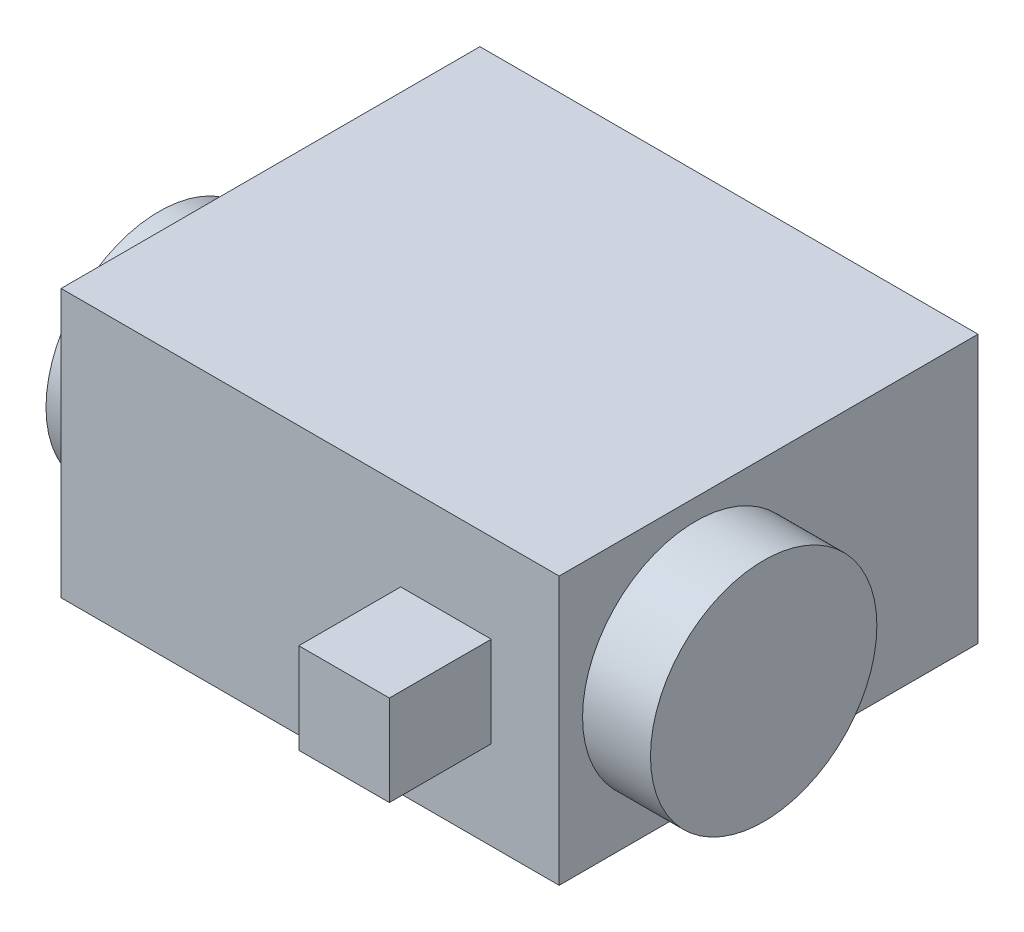
ISO-10303-21;
HEADER;
FILE_DESCRIPTION(('STEP AP214'),'2;1');
FILE_NAME('part.step','',(''),(''),'','','');
FILE_SCHEMA(('AUTOMOTIVE_DESIGN { 1 0 10303 214 1 1 1 1 }'));
ENDSEC;
DATA;
#1=APPLICATION_CONTEXT('core data for automotive mechanical design processes');
#2=APPLICATION_PROTOCOL_DEFINITION('international standard','automotive_design',2000,#1);
#3=PRODUCT_CONTEXT('',#1,'mechanical');
#4=PRODUCT('Part','Part','',(#3));
#5=PRODUCT_RELATED_PRODUCT_CATEGORY('part','',(#4));
#6=PRODUCT_DEFINITION_FORMATION('','',#4);
#7=PRODUCT_DEFINITION_CONTEXT('part definition',#1,'design');
#8=PRODUCT_DEFINITION('design','',#6,#7);
#9=PRODUCT_DEFINITION_SHAPE('','',#8);
#10=(LENGTH_UNIT() NAMED_UNIT(*) SI_UNIT(.MILLI.,.METRE.));
#11=(NAMED_UNIT(*) PLANE_ANGLE_UNIT() SI_UNIT($,.RADIAN.));
#12=(NAMED_UNIT(*) SI_UNIT($,.STERADIAN.) SOLID_ANGLE_UNIT());
#13=UNCERTAINTY_MEASURE_WITH_UNIT(LENGTH_MEASURE(1.E-05),#10,'distance_accuracy_value','');
#14=(GEOMETRIC_REPRESENTATION_CONTEXT(3) GLOBAL_UNCERTAINTY_ASSIGNED_CONTEXT((#13)) GLOBAL_UNIT_ASSIGNED_CONTEXT((#10,
#11,#12)) REPRESENTATION_CONTEXT('',''));
#15=CARTESIAN_POINT('',(0.,0.,0.));
#16=DIRECTION('',(0.,0.,1.));
#17=DIRECTION('',(1.,0.,0.));
#18=AXIS2_PLACEMENT_3D('',#15,#16,#17);
#19=CARTESIAN_POINT('',(33.,-17.75,18.1));
#20=DIRECTION('',(0.,0.,-1.));
#21=DIRECTION('',(-1.,0.,0.));
#22=AXIS2_PLACEMENT_3D('',#19,#20,#21);
#23=PLANE('',#22);
#24=DIRECTION('',(0.,-1.,0.));
#25=VECTOR('',#24,1.);
#26=CARTESIAN_POINT('',(-33.,-17.75,18.1));
#27=LINE('',#26,#25);
#28=CARTESIAN_POINT('',(-33.,17.75,18.1));
#29=VERTEX_POINT('',#28);
#30=CARTESIAN_POINT('',(-33.,-17.75,18.1));
#31=VERTEX_POINT('',#30);
#32=EDGE_CURVE('E156',#29,#31,#27,.T.);
#33=ORIENTED_EDGE('',*,*,#32,.T.);
#34=DIRECTION('',(-1.,0.,0.));
#35=VECTOR('',#34,1.);
#36=CARTESIAN_POINT('',(33.,-17.75,18.1));
#37=LINE('',#36,#35);
#38=CARTESIAN_POINT('',(33.,-17.75,18.1));
#39=VERTEX_POINT('',#38);
#40=EDGE_CURVE('E161',#39,#31,#37,.T.);
#41=ORIENTED_EDGE('',*,*,#40,.F.);
#42=DIRECTION('',(0.,-1.,0.));
#43=VECTOR('',#42,1.);
#44=CARTESIAN_POINT('',(33.,-17.75,18.1));
#45=LINE('',#44,#43);
#46=CARTESIAN_POINT('',(33.,17.75,18.1));
#47=VERTEX_POINT('',#46);
#48=EDGE_CURVE('E147',#47,#39,#45,.T.);
#49=ORIENTED_EDGE('',*,*,#48,.F.);
#50=DIRECTION('',(-1.,0.,0.));
#51=VECTOR('',#50,1.);
#52=CARTESIAN_POINT('',(33.,17.75,18.1));
#53=LINE('',#52,#51);
#54=EDGE_CURVE('E164',#47,#29,#53,.T.);
#55=ORIENTED_EDGE('',*,*,#54,.T.);
#56=EDGE_LOOP('',(#33,#41,#49,#55));
#57=FACE_BOUND('',#56,.T.);
#58=DIRECTION('',(0.,-1.,0.));
#59=VECTOR('',#58,1.);
#60=CARTESIAN_POINT('',(12.,-17.75,18.1));
#61=LINE('',#60,#59);
#62=CARTESIAN_POINT('',(12.,6.,18.1));
#63=VERTEX_POINT('',#62);
#64=CARTESIAN_POINT('',(12.,-6.,18.1));
#65=VERTEX_POINT('',#64);
#66=EDGE_CURVE('E11',#63,#65,#61,.T.);
#67=ORIENTED_EDGE('',*,*,#66,.F.);
#68=DIRECTION('',(-1.,0.,0.));
#69=VECTOR('',#68,1.);
#70=CARTESIAN_POINT('',(33.,6.,18.1));
#71=LINE('',#70,#69);
#72=CARTESIAN_POINT('',(24.,6.,18.1));
#73=VERTEX_POINT('',#72);
#74=EDGE_CURVE('E133',#73,#63,#71,.T.);
#75=ORIENTED_EDGE('',*,*,#74,.F.);
#76=DIRECTION('',(0.,1.,0.));
#77=VECTOR('',#76,1.);
#78=CARTESIAN_POINT('',(24.,-17.75,18.1));
#79=LINE('',#78,#77);
#80=CARTESIAN_POINT('',(24.,-6.,18.1));
#81=VERTEX_POINT('',#80);
#82=EDGE_CURVE('E57',#81,#73,#79,.T.);
#83=ORIENTED_EDGE('',*,*,#82,.F.);
#84=DIRECTION('',(1.,0.,0.));
#85=VECTOR('',#84,1.);
#86=CARTESIAN_POINT('',(33.,-6.,18.1));
#87=LINE('',#86,#85);
#88=EDGE_CURVE('E47',#65,#81,#87,.T.);
#89=ORIENTED_EDGE('',*,*,#88,.F.);
#90=EDGE_LOOP('',(#67,#75,#83,#89));
#91=FACE_BOUND('',#90,.T.);
#92=ADVANCED_FACE('F39',(#57,#91),#23,.F.);
#93=CARTESIAN_POINT('',(33.,17.75,-37.4));
#94=DIRECTION('',(0.,0.,1.));
#95=DIRECTION('',(1.,0.,0.));
#96=AXIS2_PLACEMENT_3D('',#93,#94,#95);
#97=PLANE('',#96);
#98=DIRECTION('',(0.,1.,0.));
#99=VECTOR('',#98,1.);
#100=CARTESIAN_POINT('',(-33.,17.75,-37.4));
#101=LINE('',#100,#99);
#102=CARTESIAN_POINT('',(-33.,-17.75,-37.4));
#103=VERTEX_POINT('',#102);
#104=CARTESIAN_POINT('',(-33.,17.75,-37.4));
#105=VERTEX_POINT('',#104);
#106=EDGE_CURVE('E140',#103,#105,#101,.T.);
#107=ORIENTED_EDGE('',*,*,#106,.T.);
#108=DIRECTION('',(-1.,0.,0.));
#109=VECTOR('',#108,1.);
#110=CARTESIAN_POINT('',(33.,17.75,-37.4));
#111=LINE('',#110,#109);
#112=CARTESIAN_POINT('',(33.,17.75,-37.4));
#113=VERTEX_POINT('',#112);
#114=EDGE_CURVE('E134',#113,#105,#111,.T.);
#115=ORIENTED_EDGE('',*,*,#114,.F.);
#116=DIRECTION('',(0.,1.,0.));
#117=VECTOR('',#116,1.);
#118=CARTESIAN_POINT('',(33.,17.75,-37.4));
#119=LINE('',#118,#117);
#120=CARTESIAN_POINT('',(33.,-17.75,-37.4));
#121=VERTEX_POINT('',#120);
#122=EDGE_CURVE('E141',#121,#113,#119,.T.);
#123=ORIENTED_EDGE('',*,*,#122,.F.);
#124=DIRECTION('',(-1.,0.,0.));
#125=VECTOR('',#124,1.);
#126=CARTESIAN_POINT('',(33.,-17.75,-37.4));
#127=LINE('',#126,#125);
#128=EDGE_CURVE('E151',#121,#103,#127,.T.);
#129=ORIENTED_EDGE('',*,*,#128,.T.);
#130=EDGE_LOOP('',(#107,#115,#123,#129));
#131=FACE_BOUND('',#130,.T.);
#132=ADVANCED_FACE('F41',(#131),#97,.F.);
#133=CARTESIAN_POINT('',(33.,17.75,18.1));
#134=DIRECTION('',(0.,-1.,0.));
#135=DIRECTION('',(0.,0.,-1.));
#136=AXIS2_PLACEMENT_3D('',#133,#134,#135);
#137=PLANE('',#136);
#138=DIRECTION('',(0.,0.,1.));
#139=VECTOR('',#138,1.);
#140=CARTESIAN_POINT('',(-33.,17.75,18.1));
#141=LINE('',#140,#139);
#142=EDGE_CURVE('E154',#105,#29,#141,.T.);
#143=ORIENTED_EDGE('',*,*,#142,.T.);
#144=ORIENTED_EDGE('',*,*,#54,.F.);
#145=DIRECTION('',(0.,0.,1.));
#146=VECTOR('',#145,1.);
#147=CARTESIAN_POINT('',(33.,17.75,18.1));
#148=LINE('',#147,#146);
#149=EDGE_CURVE('E144',#113,#47,#148,.T.);
#150=ORIENTED_EDGE('',*,*,#149,.F.);
#151=ORIENTED_EDGE('',*,*,#114,.T.);
#152=EDGE_LOOP('',(#143,#144,#150,#151));
#153=FACE_BOUND('',#152,.T.);
#154=ADVANCED_FACE('F189',(#153),#137,.F.);
#155=CARTESIAN_POINT('',(33.,-17.75,-37.4));
#156=DIRECTION('',(0.,1.,0.));
#157=DIRECTION('',(0.,0.,1.));
#158=AXIS2_PLACEMENT_3D('',#155,#156,#157);
#159=PLANE('',#158);
#160=DIRECTION('',(0.,0.,-1.));
#161=VECTOR('',#160,1.);
#162=CARTESIAN_POINT('',(-33.,-17.75,-37.4));
#163=LINE('',#162,#161);
#164=EDGE_CURVE('E145',#31,#103,#163,.T.);
#165=ORIENTED_EDGE('',*,*,#164,.T.);
#166=ORIENTED_EDGE('',*,*,#128,.F.);
#167=DIRECTION('',(0.,0.,-1.));
#168=VECTOR('',#167,1.);
#169=CARTESIAN_POINT('',(33.,-17.75,-37.4));
#170=LINE('',#169,#168);
#171=EDGE_CURVE('E149',#39,#121,#170,.T.);
#172=ORIENTED_EDGE('',*,*,#171,.F.);
#173=ORIENTED_EDGE('',*,*,#40,.T.);
#174=EDGE_LOOP('',(#165,#166,#172,#173));
#175=FACE_BOUND('',#174,.T.);
#176=ADVANCED_FACE('F192',(#175),#159,.F.);
#177=CARTESIAN_POINT('',(33.,0.,0.));
#178=DIRECTION('',(-1.,0.,0.));
#179=DIRECTION('',(0.,0.,1.));
#180=AXIS2_PLACEMENT_3D('',#177,#178,#179);
#181=PLANE('',#180);
#182=CARTESIAN_POINT('',(33.,0.,0.));
#183=DIRECTION('',(-1.,0.,0.));
#184=DIRECTION('',(0.,0.,1.));
#185=AXIS2_PLACEMENT_3D('',#182,#183,#184);
#186=CIRCLE('',#185,15.);
#187=CARTESIAN_POINT('',(33.,0.,15.));
#188=VERTEX_POINT('',#187);
#189=EDGE_CURVE('E124',#188,#188,#186,.T.);
#190=ORIENTED_EDGE('',*,*,#189,.T.);
#191=EDGE_LOOP('',(#190));
#192=FACE_BOUND('',#191,.T.);
#193=ORIENTED_EDGE('',*,*,#122,.T.);
#194=ORIENTED_EDGE('',*,*,#149,.T.);
#195=ORIENTED_EDGE('',*,*,#48,.T.);
#196=ORIENTED_EDGE('',*,*,#171,.T.);
#197=EDGE_LOOP('',(#193,#194,#195,#196));
#198=FACE_BOUND('',#197,.T.);
#199=ADVANCED_FACE('F199',(#192,#198),#181,.F.);
#200=CARTESIAN_POINT('',(-33.,0.,0.));
#201=DIRECTION('',(-1.,0.,0.));
#202=DIRECTION('',(0.,0.,1.));
#203=AXIS2_PLACEMENT_3D('',#200,#201,#202);
#204=PLANE('',#203);
#205=CARTESIAN_POINT('',(-33.,0.,0.));
#206=DIRECTION('',(-1.,0.,0.));
#207=DIRECTION('',(0.,0.,1.));
#208=AXIS2_PLACEMENT_3D('',#205,#206,#207);
#209=CIRCLE('',#208,15.);
#210=CARTESIAN_POINT('',(-33.,0.,15.));
#211=VERTEX_POINT('',#210);
#212=EDGE_CURVE('E130',#211,#211,#209,.T.);
#213=ORIENTED_EDGE('',*,*,#212,.F.);
#214=EDGE_LOOP('',(#213));
#215=FACE_BOUND('',#214,.T.);
#216=ORIENTED_EDGE('',*,*,#106,.F.);
#217=ORIENTED_EDGE('',*,*,#164,.F.);
#218=ORIENTED_EDGE('',*,*,#32,.F.);
#219=ORIENTED_EDGE('',*,*,#142,.F.);
#220=EDGE_LOOP('',(#216,#217,#218,#219));
#221=FACE_BOUND('',#220,.T.);
#222=ADVANCED_FACE('F209',(#215,#221),#204,.T.);
#223=CARTESIAN_POINT('',(42.,0.,0.));
#224=DIRECTION('',(-1.,0.,0.));
#225=DIRECTION('',(0.,0.,1.));
#226=AXIS2_PLACEMENT_3D('',#223,#224,#225);
#227=PLANE('',#226);
#228=CARTESIAN_POINT('',(42.,0.,0.));
#229=DIRECTION('',(-1.,0.,0.));
#230=DIRECTION('',(0.,0.,1.));
#231=AXIS2_PLACEMENT_3D('',#228,#229,#230);
#232=CIRCLE('',#231,15.);
#233=CARTESIAN_POINT('',(42.,0.,15.));
#234=VERTEX_POINT('',#233);
#235=EDGE_CURVE('E137',#234,#234,#232,.T.);
#236=ORIENTED_EDGE('',*,*,#235,.F.);
#237=EDGE_LOOP('',(#236));
#238=FACE_BOUND('',#237,.T.);
#239=ADVANCED_FACE('F221',(#238),#227,.F.);
#240=CARTESIAN_POINT('',(0.,0.,0.));
#241=DIRECTION('',(-1.,0.,0.));
#242=DIRECTION('',(0.,0.,1.));
#243=AXIS2_PLACEMENT_3D('',#240,#241,#242);
#244=CYLINDRICAL_SURFACE('',#243,15.);
#245=ORIENTED_EDGE('',*,*,#189,.F.);
#246=EDGE_LOOP('',(#245));
#247=FACE_BOUND('',#246,.T.);
#248=ORIENTED_EDGE('',*,*,#235,.T.);
#249=EDGE_LOOP('',(#248));
#250=FACE_BOUND('',#249,.T.);
#251=ADVANCED_FACE('F225',(#247,#250),#244,.T.);
#252=CARTESIAN_POINT('',(-38.1,15.,0.));
#253=DIRECTION('',(1.,0.,0.));
#254=DIRECTION('',(0.,0.,-1.));
#255=AXIS2_PLACEMENT_3D('',#252,#253,#254);
#256=PLANE('',#255);
#257=CARTESIAN_POINT('',(-38.1,0.,0.));
#258=DIRECTION('',(-1.,0.,0.));
#259=DIRECTION('',(0.,0.,1.));
#260=AXIS2_PLACEMENT_3D('',#257,#258,#259);
#261=CIRCLE('',#260,15.);
#262=CARTESIAN_POINT('',(-38.1,0.,15.));
#263=VERTEX_POINT('',#262);
#264=EDGE_CURVE('E121',#263,#263,#261,.T.);
#265=ORIENTED_EDGE('',*,*,#264,.T.);
#266=EDGE_LOOP('',(#265));
#267=FACE_BOUND('',#266,.T.);
#268=ADVANCED_FACE('F229',(#267),#256,.F.);
#269=CARTESIAN_POINT('',(0.,0.,0.));
#270=DIRECTION('',(-1.,0.,0.));
#271=DIRECTION('',(0.,0.,1.));
#272=AXIS2_PLACEMENT_3D('',#269,#270,#271);
#273=CYLINDRICAL_SURFACE('',#272,15.);
#274=ORIENTED_EDGE('',*,*,#264,.F.);
#275=EDGE_LOOP('',(#274));
#276=FACE_BOUND('',#275,.T.);
#277=ORIENTED_EDGE('',*,*,#212,.T.);
#278=EDGE_LOOP('',(#277));
#279=FACE_BOUND('',#278,.T.);
#280=ADVANCED_FACE('F233',(#276,#279),#273,.T.);
#281=CARTESIAN_POINT('',(12.,6.,31.6));
#282=DIRECTION('',(1.,0.,0.));
#283=DIRECTION('',(0.,0.,-1.));
#284=AXIS2_PLACEMENT_3D('',#281,#282,#283);
#285=PLANE('',#284);
#286=DIRECTION('',(0.,0.,-1.));
#287=VECTOR('',#286,1.);
#288=CARTESIAN_POINT('',(12.,6.,31.6));
#289=LINE('',#288,#287);
#290=CARTESIAN_POINT('',(12.,6.,31.6));
#291=VERTEX_POINT('',#290);
#292=EDGE_CURVE('E176',#291,#63,#289,.T.);
#293=ORIENTED_EDGE('',*,*,#292,.T.);
#294=ORIENTED_EDGE('',*,*,#66,.T.);
#295=DIRECTION('',(0.,0.,-1.));
#296=VECTOR('',#295,1.);
#297=CARTESIAN_POINT('',(12.,-6.,31.6));
#298=LINE('',#297,#296);
#299=CARTESIAN_POINT('',(12.,-6.,31.6));
#300=VERTEX_POINT('',#299);
#301=EDGE_CURVE('E104',#300,#65,#298,.T.);
#302=ORIENTED_EDGE('',*,*,#301,.F.);
#303=DIRECTION('',(0.,-1.,0.));
#304=VECTOR('',#303,1.);
#305=CARTESIAN_POINT('',(12.,6.,31.6));
#306=LINE('',#305,#304);
#307=EDGE_CURVE('E110',#291,#300,#306,.T.);
#308=ORIENTED_EDGE('',*,*,#307,.F.);
#309=EDGE_LOOP('',(#293,#294,#302,#308));
#310=FACE_BOUND('',#309,.T.);
#311=ADVANCED_FACE('F120',(#310),#285,.F.);
#312=CARTESIAN_POINT('',(12.,-6.,31.6));
#313=DIRECTION('',(0.,1.,0.));
#314=DIRECTION('',(0.,0.,1.));
#315=AXIS2_PLACEMENT_3D('',#312,#313,#314);
#316=PLANE('',#315);
#317=ORIENTED_EDGE('',*,*,#301,.T.);
#318=ORIENTED_EDGE('',*,*,#88,.T.);
#319=DIRECTION('',(0.,0.,-1.));
#320=VECTOR('',#319,1.);
#321=CARTESIAN_POINT('',(24.,-6.,31.6));
#322=LINE('',#321,#320);
#323=CARTESIAN_POINT('',(24.,-6.,31.6));
#324=VERTEX_POINT('',#323);
#325=EDGE_CURVE('E106',#324,#81,#322,.T.);
#326=ORIENTED_EDGE('',*,*,#325,.F.);
#327=DIRECTION('',(1.,0.,0.));
#328=VECTOR('',#327,1.);
#329=CARTESIAN_POINT('',(12.,-6.,31.6));
#330=LINE('',#329,#328);
#331=EDGE_CURVE('E100',#300,#324,#330,.T.);
#332=ORIENTED_EDGE('',*,*,#331,.F.);
#333=EDGE_LOOP('',(#317,#318,#326,#332));
#334=FACE_BOUND('',#333,.T.);
#335=ADVANCED_FACE('F102',(#334),#316,.F.);
#336=CARTESIAN_POINT('',(24.,-6.,31.6));
#337=DIRECTION('',(-1.,0.,0.));
#338=DIRECTION('',(0.,0.,1.));
#339=AXIS2_PLACEMENT_3D('',#336,#337,#338);
#340=PLANE('',#339);
#341=ORIENTED_EDGE('',*,*,#325,.T.);
#342=ORIENTED_EDGE('',*,*,#82,.T.);
#343=DIRECTION('',(0.,0.,-1.));
#344=VECTOR('',#343,1.);
#345=CARTESIAN_POINT('',(24.,6.,31.6));
#346=LINE('',#345,#344);
#347=CARTESIAN_POINT('',(24.,6.,31.6));
#348=VERTEX_POINT('',#347);
#349=EDGE_CURVE('E126',#348,#73,#346,.T.);
#350=ORIENTED_EDGE('',*,*,#349,.F.);
#351=DIRECTION('',(0.,1.,0.));
#352=VECTOR('',#351,1.);
#353=CARTESIAN_POINT('',(24.,-6.,31.6));
#354=LINE('',#353,#352);
#355=EDGE_CURVE('E109',#324,#348,#354,.T.);
#356=ORIENTED_EDGE('',*,*,#355,.F.);
#357=EDGE_LOOP('',(#341,#342,#350,#356));
#358=FACE_BOUND('',#357,.T.);
#359=ADVANCED_FACE('F172',(#358),#340,.F.);
#360=CARTESIAN_POINT('',(24.,6.,31.6));
#361=DIRECTION('',(0.,-1.,0.));
#362=DIRECTION('',(0.,0.,-1.));
#363=AXIS2_PLACEMENT_3D('',#360,#361,#362);
#364=PLANE('',#363);
#365=ORIENTED_EDGE('',*,*,#349,.T.);
#366=ORIENTED_EDGE('',*,*,#74,.T.);
#367=ORIENTED_EDGE('',*,*,#292,.F.);
#368=DIRECTION('',(-1.,0.,0.));
#369=VECTOR('',#368,1.);
#370=CARTESIAN_POINT('',(24.,6.,31.6));
#371=LINE('',#370,#369);
#372=EDGE_CURVE('E115',#348,#291,#371,.T.);
#373=ORIENTED_EDGE('',*,*,#372,.F.);
#374=EDGE_LOOP('',(#365,#366,#367,#373));
#375=FACE_BOUND('',#374,.T.);
#376=ADVANCED_FACE('F180',(#375),#364,.F.);
#377=CARTESIAN_POINT('',(0.,0.,31.6));
#378=DIRECTION('',(0.,0.,1.));
#379=DIRECTION('',(1.,0.,0.));
#380=AXIS2_PLACEMENT_3D('',#377,#378,#379);
#381=PLANE('',#380);
#382=ORIENTED_EDGE('',*,*,#307,.T.);
#383=ORIENTED_EDGE('',*,*,#331,.T.);
#384=ORIENTED_EDGE('',*,*,#355,.T.);
#385=ORIENTED_EDGE('',*,*,#372,.T.);
#386=EDGE_LOOP('',(#382,#383,#384,#385));
#387=FACE_BOUND('',#386,.T.);
#388=ADVANCED_FACE('F113',(#387),#381,.T.);
#389=CLOSED_SHELL('',(#92,#132,#154,#176,#199,#222,#239,#251,#268,#280,#311,#335,#359,#376,#388));
#390=MANIFOLD_SOLID_BREP('B2',#389);
#391=ADVANCED_BREP_SHAPE_REPRESENTATION('',(#18,#390),#14);
#392=SHAPE_DEFINITION_REPRESENTATION(#9,#391);
ENDSEC;
END-ISO-10303-21;
